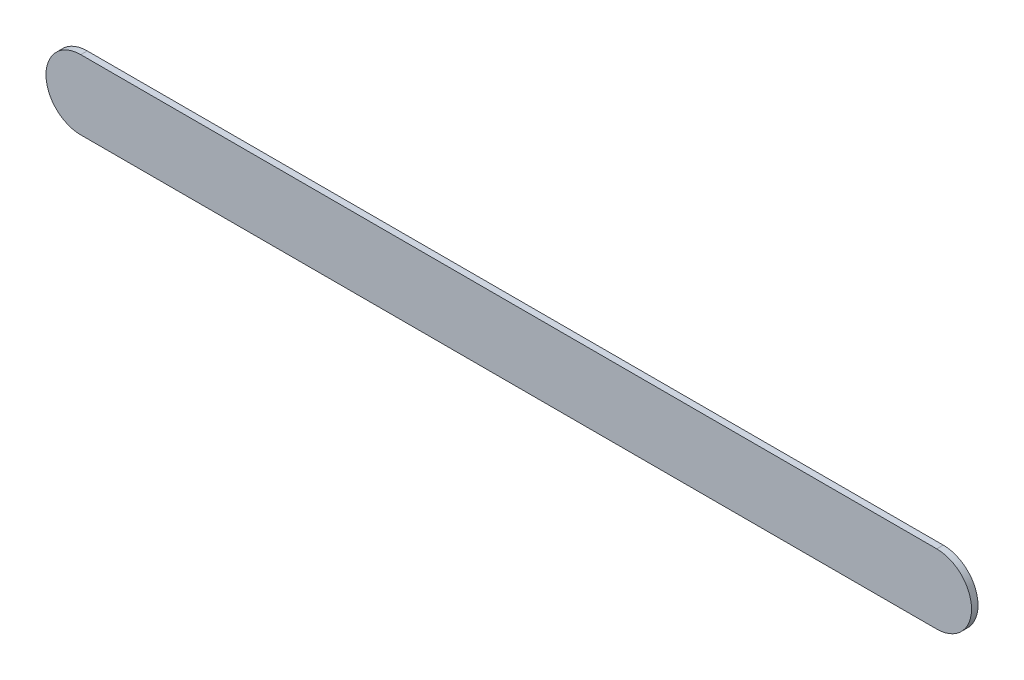
ISO-10303-21;
HEADER;
FILE_DESCRIPTION(('STEP AP214'),'2;1');
FILE_NAME('part.step','',(''),(''),'','','');
FILE_SCHEMA(('AUTOMOTIVE_DESIGN { 1 0 10303 214 1 1 1 1 }'));
ENDSEC;
DATA;
#1=APPLICATION_CONTEXT('core data for automotive mechanical design processes');
#2=APPLICATION_PROTOCOL_DEFINITION('international standard','automotive_design',2000,#1);
#3=PRODUCT_CONTEXT('',#1,'mechanical');
#4=PRODUCT('Part','Part','',(#3));
#5=PRODUCT_RELATED_PRODUCT_CATEGORY('part','',(#4));
#6=PRODUCT_DEFINITION_FORMATION('','',#4);
#7=PRODUCT_DEFINITION_CONTEXT('part definition',#1,'design');
#8=PRODUCT_DEFINITION('design','',#6,#7);
#9=PRODUCT_DEFINITION_SHAPE('','',#8);
#10=(LENGTH_UNIT() NAMED_UNIT(*) SI_UNIT(.MILLI.,.METRE.));
#11=(NAMED_UNIT(*) PLANE_ANGLE_UNIT() SI_UNIT($,.RADIAN.));
#12=(NAMED_UNIT(*) SI_UNIT($,.STERADIAN.) SOLID_ANGLE_UNIT());
#13=UNCERTAINTY_MEASURE_WITH_UNIT(LENGTH_MEASURE(1.E-05),#10,'distance_accuracy_value','');
#14=(GEOMETRIC_REPRESENTATION_CONTEXT(3) GLOBAL_UNCERTAINTY_ASSIGNED_CONTEXT((#13)) GLOBAL_UNIT_ASSIGNED_CONTEXT((#10,
#11,#12)) REPRESENTATION_CONTEXT('',''));
#15=CARTESIAN_POINT('',(0.,0.,0.));
#16=DIRECTION('',(0.,0.,1.));
#17=DIRECTION('',(1.,0.,0.));
#18=AXIS2_PLACEMENT_3D('',#15,#16,#17);
#19=CARTESIAN_POINT('',(6.67303974,12.2555,0.));
#20=DIRECTION('',(0.,1.,0.));
#21=DIRECTION('',(1.,0.,0.));
#22=AXIS2_PLACEMENT_3D('',#19,#20,#21);
#23=PLANE('',#22);
#24=DIRECTION('',(1.,0.,0.));
#25=VECTOR('',#24,1.);
#26=CARTESIAN_POINT('',(6.67303974,12.2555,0.03556));
#27=LINE('',#26,#25);
#28=CARTESIAN_POINT('',(6.67303974,12.2555,0.03556));
#29=VERTEX_POINT('',#28);
#30=CARTESIAN_POINT('',(11.36400064,12.2555,0.03556));
#31=VERTEX_POINT('',#30);
#32=EDGE_CURVE('E11',#29,#31,#27,.T.);
#33=ORIENTED_EDGE('',*,*,#32,.F.);
#34=DIRECTION('',(0.,0.,1.));
#35=VECTOR('',#34,1.);
#36=CARTESIAN_POINT('',(6.67303974,12.2555,0.));
#37=LINE('',#36,#35);
#38=CARTESIAN_POINT('',(6.67303974,12.2555,0.));
#39=VERTEX_POINT('',#38);
#40=EDGE_CURVE('E23',#39,#29,#37,.T.);
#41=ORIENTED_EDGE('',*,*,#40,.F.);
#42=DIRECTION('',(1.,0.,0.));
#43=VECTOR('',#42,1.);
#44=CARTESIAN_POINT('',(6.67303974,12.2555,0.));
#45=LINE('',#44,#43);
#46=CARTESIAN_POINT('',(11.36400064,12.2555,0.));
#47=VERTEX_POINT('',#46);
#48=EDGE_CURVE('E74',#39,#47,#45,.T.);
#49=ORIENTED_EDGE('',*,*,#48,.T.);
#50=DIRECTION('',(0.,0.,1.));
#51=VECTOR('',#50,1.);
#52=CARTESIAN_POINT('',(11.36400064,12.2555,0.));
#53=LINE('',#52,#51);
#54=EDGE_CURVE('E36',#47,#31,#53,.T.);
#55=ORIENTED_EDGE('',*,*,#54,.T.);
#56=EDGE_LOOP('',(#33,#41,#49,#55));
#57=FACE_BOUND('',#56,.T.);
#58=ADVANCED_FACE('F16',(#57),#23,.F.);
#59=CARTESIAN_POINT('',(11.36400064,12.446,0.));
#60=DIRECTION('',(0.,0.,-1.));
#61=DIRECTION('',(0.,-1.,0.));
#62=AXIS2_PLACEMENT_3D('',#59,#60,#61);
#63=CYLINDRICAL_SURFACE('',#62,0.1905);
#64=CARTESIAN_POINT('',(11.36400064,12.446,0.03556));
#65=DIRECTION('',(0.,0.,1.));
#66=DIRECTION('',(0.,-1.,0.));
#67=AXIS2_PLACEMENT_3D('',#64,#65,#66);
#68=CIRCLE('',#67,0.1905);
#69=CARTESIAN_POINT('',(11.36400064,12.6365,0.03556));
#70=VERTEX_POINT('',#69);
#71=EDGE_CURVE('E82',#31,#70,#68,.T.);
#72=ORIENTED_EDGE('',*,*,#71,.F.);
#73=ORIENTED_EDGE('',*,*,#54,.F.);
#74=CARTESIAN_POINT('',(11.36400064,12.446,0.));
#75=DIRECTION('',(0.,0.,1.));
#76=DIRECTION('',(0.,-1.,0.));
#77=AXIS2_PLACEMENT_3D('',#74,#75,#76);
#78=CIRCLE('',#77,0.1905);
#79=CARTESIAN_POINT('',(11.36400064,12.6365,0.));
#80=VERTEX_POINT('',#79);
#81=EDGE_CURVE('E80',#47,#80,#78,.T.);
#82=ORIENTED_EDGE('',*,*,#81,.T.);
#83=DIRECTION('',(0.,0.,1.));
#84=VECTOR('',#83,1.);
#85=CARTESIAN_POINT('',(11.36400064,12.6365,0.));
#86=LINE('',#85,#84);
#87=EDGE_CURVE('E66',#80,#70,#86,.T.);
#88=ORIENTED_EDGE('',*,*,#87,.T.);
#89=EDGE_LOOP('',(#72,#73,#82,#88));
#90=FACE_BOUND('',#89,.T.);
#91=ADVANCED_FACE('F88',(#90),#63,.T.);
#92=CARTESIAN_POINT('',(11.36400064,12.6365,0.));
#93=DIRECTION('',(0.,-1.,0.));
#94=DIRECTION('',(-1.,0.,0.));
#95=AXIS2_PLACEMENT_3D('',#92,#93,#94);
#96=PLANE('',#95);
#97=DIRECTION('',(-1.,0.,0.));
#98=VECTOR('',#97,1.);
#99=CARTESIAN_POINT('',(11.36400064,12.6365,0.03556));
#100=LINE('',#99,#98);
#101=CARTESIAN_POINT('',(6.67303974,12.6365,0.03556));
#102=VERTEX_POINT('',#101);
#103=EDGE_CURVE('E70',#70,#102,#100,.T.);
#104=ORIENTED_EDGE('',*,*,#103,.F.);
#105=ORIENTED_EDGE('',*,*,#87,.F.);
#106=DIRECTION('',(-1.,0.,0.));
#107=VECTOR('',#106,1.);
#108=CARTESIAN_POINT('',(11.36400064,12.6365,0.));
#109=LINE('',#108,#107);
#110=CARTESIAN_POINT('',(6.67303974,12.6365,0.));
#111=VERTEX_POINT('',#110);
#112=EDGE_CURVE('E62',#80,#111,#109,.T.);
#113=ORIENTED_EDGE('',*,*,#112,.T.);
#114=DIRECTION('',(0.,0.,1.));
#115=VECTOR('',#114,1.);
#116=CARTESIAN_POINT('',(6.67303974,12.6365,0.));
#117=LINE('',#116,#115);
#118=EDGE_CURVE('E52',#111,#102,#117,.T.);
#119=ORIENTED_EDGE('',*,*,#118,.T.);
#120=EDGE_LOOP('',(#104,#105,#113,#119));
#121=FACE_BOUND('',#120,.T.);
#122=ADVANCED_FACE('F65',(#121),#96,.F.);
#123=CARTESIAN_POINT('',(6.67303974,12.446,0.));
#124=DIRECTION('',(0.,0.,-1.));
#125=DIRECTION('',(0.,1.,0.));
#126=AXIS2_PLACEMENT_3D('',#123,#124,#125);
#127=CYLINDRICAL_SURFACE('',#126,0.1905);
#128=CARTESIAN_POINT('',(6.67303974,12.446,0.03556));
#129=DIRECTION('',(0.,0.,1.));
#130=DIRECTION('',(0.,1.,0.));
#131=AXIS2_PLACEMENT_3D('',#128,#129,#130);
#132=CIRCLE('',#131,0.1905);
#133=EDGE_CURVE('E58',#102,#29,#132,.T.);
#134=ORIENTED_EDGE('',*,*,#133,.F.);
#135=ORIENTED_EDGE('',*,*,#118,.F.);
#136=CARTESIAN_POINT('',(6.67303974,12.446,0.));
#137=DIRECTION('',(0.,0.,1.));
#138=DIRECTION('',(0.,1.,0.));
#139=AXIS2_PLACEMENT_3D('',#136,#137,#138);
#140=CIRCLE('',#139,0.1905);
#141=EDGE_CURVE('E56',#111,#39,#140,.T.);
#142=ORIENTED_EDGE('',*,*,#141,.T.);
#143=ORIENTED_EDGE('',*,*,#40,.T.);
#144=EDGE_LOOP('',(#134,#135,#142,#143));
#145=FACE_BOUND('',#144,.T.);
#146=ADVANCED_FACE('F54',(#145),#127,.T.);
#147=CARTESIAN_POINT('',(9.01852019,12.446,0.));
#148=DIRECTION('',(0.,0.,1.));
#149=DIRECTION('',(1.,0.,0.));
#150=AXIS2_PLACEMENT_3D('',#147,#148,#149);
#151=PLANE('',#150);
#152=ORIENTED_EDGE('',*,*,#141,.F.);
#153=ORIENTED_EDGE('',*,*,#112,.F.);
#154=ORIENTED_EDGE('',*,*,#81,.F.);
#155=ORIENTED_EDGE('',*,*,#48,.F.);
#156=EDGE_LOOP('',(#152,#153,#154,#155));
#157=FACE_BOUND('',#156,.T.);
#158=ADVANCED_FACE('F73',(#157),#151,.F.);
#159=CARTESIAN_POINT('',(9.01852019,12.446,0.03556));
#160=DIRECTION('',(0.,0.,1.));
#161=DIRECTION('',(1.,0.,0.));
#162=AXIS2_PLACEMENT_3D('',#159,#160,#161);
#163=PLANE('',#162);
#164=ORIENTED_EDGE('',*,*,#32,.T.);
#165=ORIENTED_EDGE('',*,*,#71,.T.);
#166=ORIENTED_EDGE('',*,*,#103,.T.);
#167=ORIENTED_EDGE('',*,*,#133,.T.);
#168=EDGE_LOOP('',(#164,#165,#166,#167));
#169=FACE_BOUND('',#168,.T.);
#170=ADVANCED_FACE('F90',(#169),#163,.T.);
#171=CLOSED_SHELL('',(#58,#91,#122,#146,#158,#170));
#172=MANIFOLD_SOLID_BREP('B1',#171);
#173=ADVANCED_BREP_SHAPE_REPRESENTATION('',(#18,#172),#14);
#174=SHAPE_DEFINITION_REPRESENTATION(#9,#173);
ENDSEC;
END-ISO-10303-21;
